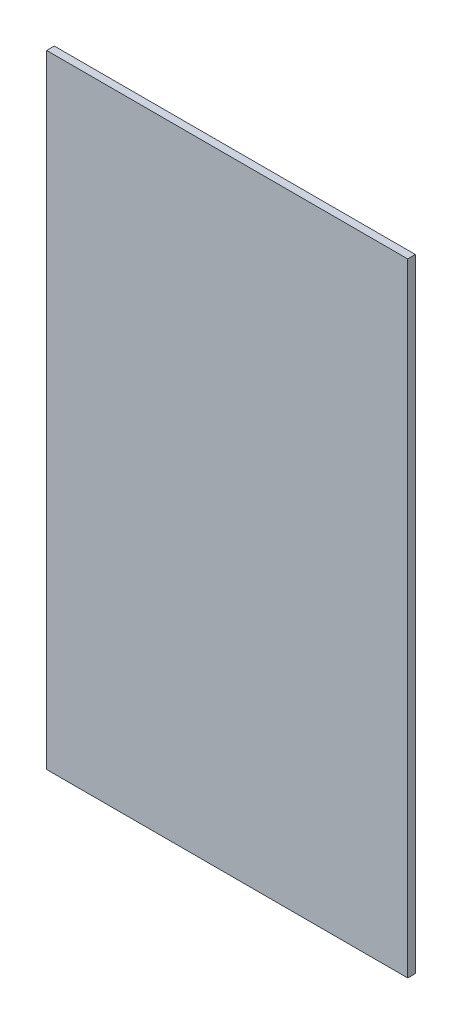
ISO-10303-21;
HEADER;
FILE_DESCRIPTION(('STEP AP214'),'2;1');
FILE_NAME('part.step','',(''),(''),'','','');
FILE_SCHEMA(('AUTOMOTIVE_DESIGN { 1 0 10303 214 1 1 1 1 }'));
ENDSEC;
DATA;
#1=APPLICATION_CONTEXT('core data for automotive mechanical design processes');
#2=APPLICATION_PROTOCOL_DEFINITION('international standard','automotive_design',2000,#1);
#3=PRODUCT_CONTEXT('',#1,'mechanical');
#4=PRODUCT('Part','Part','',(#3));
#5=PRODUCT_RELATED_PRODUCT_CATEGORY('part','',(#4));
#6=PRODUCT_DEFINITION_FORMATION('','',#4);
#7=PRODUCT_DEFINITION_CONTEXT('part definition',#1,'design');
#8=PRODUCT_DEFINITION('design','',#6,#7);
#9=PRODUCT_DEFINITION_SHAPE('','',#8);
#10=(LENGTH_UNIT() NAMED_UNIT(*) SI_UNIT(.MILLI.,.METRE.));
#11=(NAMED_UNIT(*) PLANE_ANGLE_UNIT() SI_UNIT($,.RADIAN.));
#12=(NAMED_UNIT(*) SI_UNIT($,.STERADIAN.) SOLID_ANGLE_UNIT());
#13=UNCERTAINTY_MEASURE_WITH_UNIT(LENGTH_MEASURE(1.E-05),#10,'distance_accuracy_value','');
#14=(GEOMETRIC_REPRESENTATION_CONTEXT(3) GLOBAL_UNCERTAINTY_ASSIGNED_CONTEXT((#13)) GLOBAL_UNIT_ASSIGNED_CONTEXT((#10,
#11,#12)) REPRESENTATION_CONTEXT('',''));
#15=CARTESIAN_POINT('',(0.,0.,0.));
#16=DIRECTION('',(0.,0.,1.));
#17=DIRECTION('',(1.,0.,0.));
#18=AXIS2_PLACEMENT_3D('',#15,#16,#17);
#19=CARTESIAN_POINT('',(0.,0.,3.));
#20=DIRECTION('',(1.,0.,0.));
#21=DIRECTION('',(0.,0.,-1.));
#22=AXIS2_PLACEMENT_3D('',#19,#20,#21);
#23=PLANE('',#22);
#24=DIRECTION('',(0.,-1.,0.));
#25=VECTOR('',#24,1.);
#26=CARTESIAN_POINT('',(0.,0.,0.));
#27=LINE('',#26,#25);
#28=CARTESIAN_POINT('',(0.,243.83,0.));
#29=VERTEX_POINT('',#28);
#30=CARTESIAN_POINT('',(0.,0.,0.));
#31=VERTEX_POINT('',#30);
#32=EDGE_CURVE('E107',#29,#31,#27,.T.);
#33=ORIENTED_EDGE('',*,*,#32,.T.);
#34=DIRECTION('',(0.,0.,-1.));
#35=VECTOR('',#34,1.);
#36=CARTESIAN_POINT('',(0.,0.,3.));
#37=LINE('',#36,#35);
#38=CARTESIAN_POINT('',(0.,0.,3.));
#39=VERTEX_POINT('',#38);
#40=EDGE_CURVE('E11',#39,#31,#37,.T.);
#41=ORIENTED_EDGE('',*,*,#40,.F.);
#42=DIRECTION('',(0.,-1.,0.));
#43=VECTOR('',#42,1.);
#44=CARTESIAN_POINT('',(0.,0.,3.));
#45=LINE('',#44,#43);
#46=CARTESIAN_POINT('',(0.,243.83,3.));
#47=VERTEX_POINT('',#46);
#48=EDGE_CURVE('E91',#47,#39,#45,.T.);
#49=ORIENTED_EDGE('',*,*,#48,.F.);
#50=DIRECTION('',(0.,0.,-1.));
#51=VECTOR('',#50,1.);
#52=CARTESIAN_POINT('',(0.,243.83,3.));
#53=LINE('',#52,#51);
#54=EDGE_CURVE('E103',#47,#29,#53,.T.);
#55=ORIENTED_EDGE('',*,*,#54,.T.);
#56=EDGE_LOOP('',(#33,#41,#49,#55));
#57=FACE_BOUND('',#56,.T.);
#58=ADVANCED_FACE('F39',(#57),#23,.F.);
#59=CARTESIAN_POINT('',(0.,0.,3.));
#60=DIRECTION('',(0.,1.,0.));
#61=DIRECTION('',(0.,0.,1.));
#62=AXIS2_PLACEMENT_3D('',#59,#60,#61);
#63=PLANE('',#62);
#64=DIRECTION('',(1.,0.,0.));
#65=VECTOR('',#64,1.);
#66=CARTESIAN_POINT('',(0.,0.,0.));
#67=LINE('',#66,#65);
#68=CARTESIAN_POINT('',(141.39,0.,0.));
#69=VERTEX_POINT('',#68);
#70=EDGE_CURVE('E96',#31,#69,#67,.T.);
#71=ORIENTED_EDGE('',*,*,#70,.T.);
#72=DIRECTION('',(0.,0.,-1.));
#73=VECTOR('',#72,1.);
#74=CARTESIAN_POINT('',(141.39,0.,3.));
#75=LINE('',#74,#73);
#76=CARTESIAN_POINT('',(141.39,0.,3.));
#77=VERTEX_POINT('',#76);
#78=EDGE_CURVE('E48',#77,#69,#75,.T.);
#79=ORIENTED_EDGE('',*,*,#78,.F.);
#80=DIRECTION('',(1.,0.,0.));
#81=VECTOR('',#80,1.);
#82=CARTESIAN_POINT('',(0.,0.,3.));
#83=LINE('',#82,#81);
#84=EDGE_CURVE('E86',#39,#77,#83,.T.);
#85=ORIENTED_EDGE('',*,*,#84,.F.);
#86=ORIENTED_EDGE('',*,*,#40,.T.);
#87=EDGE_LOOP('',(#71,#79,#85,#86));
#88=FACE_BOUND('',#87,.T.);
#89=ADVANCED_FACE('F95',(#88),#63,.F.);
#90=CARTESIAN_POINT('',(141.39,0.,3.));
#91=DIRECTION('',(-1.,0.,0.));
#92=DIRECTION('',(0.,0.,1.));
#93=AXIS2_PLACEMENT_3D('',#90,#91,#92);
#94=PLANE('',#93);
#95=DIRECTION('',(0.,1.,0.));
#96=VECTOR('',#95,1.);
#97=CARTESIAN_POINT('',(141.39,0.,0.));
#98=LINE('',#97,#96);
#99=CARTESIAN_POINT('',(141.39,243.83,0.));
#100=VERTEX_POINT('',#99);
#101=EDGE_CURVE('E73',#69,#100,#98,.T.);
#102=ORIENTED_EDGE('',*,*,#101,.T.);
#103=DIRECTION('',(0.,0.,-1.));
#104=VECTOR('',#103,1.);
#105=CARTESIAN_POINT('',(141.39,243.83,3.));
#106=LINE('',#105,#104);
#107=CARTESIAN_POINT('',(141.39,243.83,3.));
#108=VERTEX_POINT('',#107);
#109=EDGE_CURVE('E98',#108,#100,#106,.T.);
#110=ORIENTED_EDGE('',*,*,#109,.F.);
#111=DIRECTION('',(0.,1.,0.));
#112=VECTOR('',#111,1.);
#113=CARTESIAN_POINT('',(141.39,0.,3.));
#114=LINE('',#113,#112);
#115=EDGE_CURVE('E89',#77,#108,#114,.T.);
#116=ORIENTED_EDGE('',*,*,#115,.F.);
#117=ORIENTED_EDGE('',*,*,#78,.T.);
#118=EDGE_LOOP('',(#102,#110,#116,#117));
#119=FACE_BOUND('',#118,.T.);
#120=ADVANCED_FACE('F99',(#119),#94,.F.);
#121=CARTESIAN_POINT('',(0.,243.83,3.));
#122=DIRECTION('',(0.,-1.,0.));
#123=DIRECTION('',(0.,0.,-1.));
#124=AXIS2_PLACEMENT_3D('',#121,#122,#123);
#125=PLANE('',#124);
#126=DIRECTION('',(-1.,0.,0.));
#127=VECTOR('',#126,1.);
#128=CARTESIAN_POINT('',(0.,243.83,0.));
#129=LINE('',#128,#127);
#130=EDGE_CURVE('E79',#100,#29,#129,.T.);
#131=ORIENTED_EDGE('',*,*,#130,.T.);
#132=ORIENTED_EDGE('',*,*,#54,.F.);
#133=DIRECTION('',(-1.,0.,0.));
#134=VECTOR('',#133,1.);
#135=CARTESIAN_POINT('',(0.,243.83,3.));
#136=LINE('',#135,#134);
#137=EDGE_CURVE('E56',#108,#47,#136,.T.);
#138=ORIENTED_EDGE('',*,*,#137,.F.);
#139=ORIENTED_EDGE('',*,*,#109,.T.);
#140=EDGE_LOOP('',(#131,#132,#138,#139));
#141=FACE_BOUND('',#140,.T.);
#142=ADVANCED_FACE('F120',(#141),#125,.F.);
#143=CARTESIAN_POINT('',(0.,0.,3.));
#144=DIRECTION('',(0.,0.,-1.));
#145=DIRECTION('',(-1.,0.,0.));
#146=AXIS2_PLACEMENT_3D('',#143,#144,#145);
#147=PLANE('',#146);
#148=ORIENTED_EDGE('',*,*,#48,.T.);
#149=ORIENTED_EDGE('',*,*,#84,.T.);
#150=ORIENTED_EDGE('',*,*,#115,.T.);
#151=ORIENTED_EDGE('',*,*,#137,.T.);
#152=EDGE_LOOP('',(#148,#149,#150,#151));
#153=FACE_BOUND('',#152,.T.);
#154=ADVANCED_FACE('F87',(#153),#147,.F.);
#155=CARTESIAN_POINT('',(0.,0.,0.));
#156=DIRECTION('',(0.,0.,-1.));
#157=DIRECTION('',(-1.,0.,0.));
#158=AXIS2_PLACEMENT_3D('',#155,#156,#157);
#159=PLANE('',#158);
#160=ORIENTED_EDGE('',*,*,#32,.F.);
#161=ORIENTED_EDGE('',*,*,#130,.F.);
#162=ORIENTED_EDGE('',*,*,#101,.F.);
#163=ORIENTED_EDGE('',*,*,#70,.F.);
#164=EDGE_LOOP('',(#160,#161,#162,#163));
#165=FACE_BOUND('',#164,.T.);
#166=ADVANCED_FACE('F123',(#165),#159,.T.);
#167=CLOSED_SHELL('',(#58,#89,#120,#142,#154,#166));
#168=MANIFOLD_SOLID_BREP('B2',#167);
#169=ADVANCED_BREP_SHAPE_REPRESENTATION('',(#18,#168),#14);
#170=SHAPE_DEFINITION_REPRESENTATION(#9,#169);
ENDSEC;
END-ISO-10303-21;
